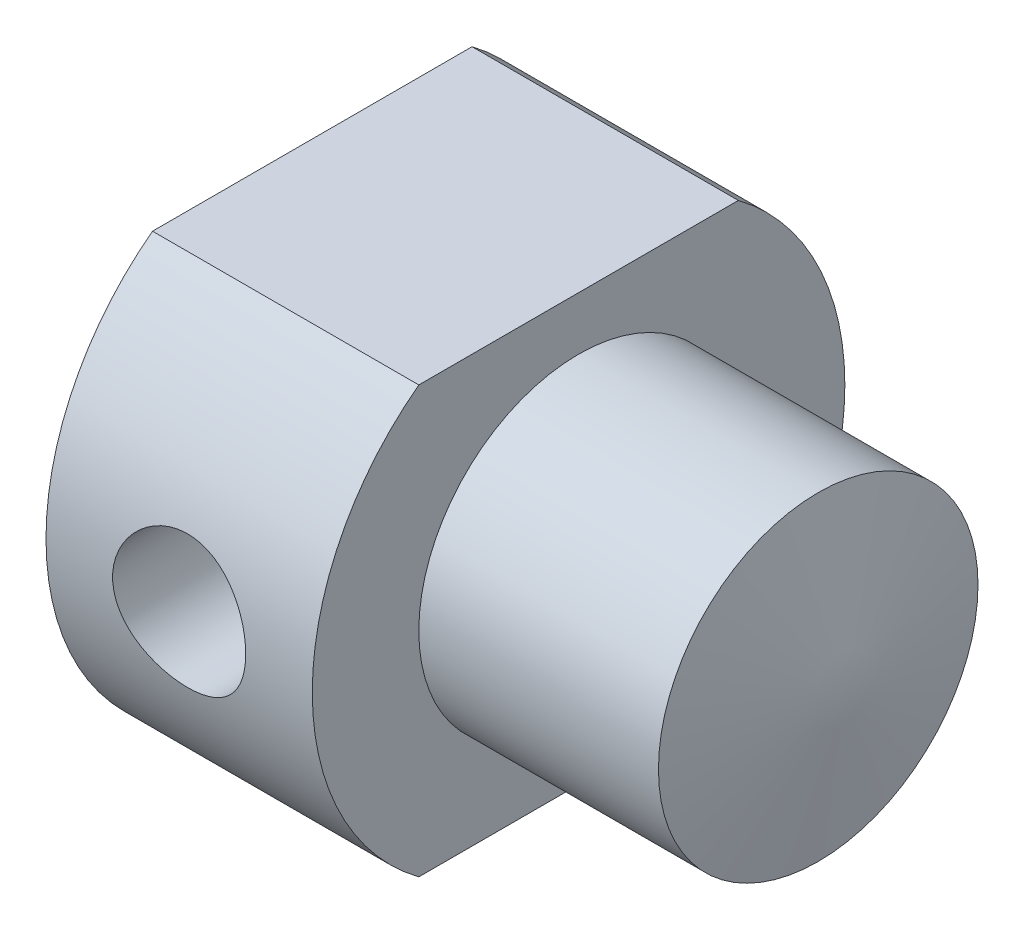
ISO-10303-21;
HEADER;
FILE_DESCRIPTION(('STEP AP214'),'2;1');
FILE_NAME('part.step','',(''),(''),'','','');
FILE_SCHEMA(('AUTOMOTIVE_DESIGN { 1 0 10303 214 1 1 1 1 }'));
ENDSEC;
DATA;
#1=APPLICATION_CONTEXT('core data for automotive mechanical design processes');
#2=APPLICATION_PROTOCOL_DEFINITION('international standard','automotive_design',2000,#1);
#3=PRODUCT_CONTEXT('',#1,'mechanical');
#4=PRODUCT('Part','Part','',(#3));
#5=PRODUCT_RELATED_PRODUCT_CATEGORY('part','',(#4));
#6=PRODUCT_DEFINITION_FORMATION('','',#4);
#7=PRODUCT_DEFINITION_CONTEXT('part definition',#1,'design');
#8=PRODUCT_DEFINITION('design','',#6,#7);
#9=PRODUCT_DEFINITION_SHAPE('','',#8);
#10=(LENGTH_UNIT() NAMED_UNIT(*) SI_UNIT(.MILLI.,.METRE.));
#11=(NAMED_UNIT(*) PLANE_ANGLE_UNIT() SI_UNIT($,.RADIAN.));
#12=(NAMED_UNIT(*) SI_UNIT($,.STERADIAN.) SOLID_ANGLE_UNIT());
#13=UNCERTAINTY_MEASURE_WITH_UNIT(LENGTH_MEASURE(1.E-05),#10,'distance_accuracy_value','');
#14=(GEOMETRIC_REPRESENTATION_CONTEXT(3) GLOBAL_UNCERTAINTY_ASSIGNED_CONTEXT((#13)) GLOBAL_UNIT_ASSIGNED_CONTEXT((#10,
#11,#12)) REPRESENTATION_CONTEXT('',''));
#15=CARTESIAN_POINT('',(0.,0.,0.));
#16=DIRECTION('',(0.,0.,1.));
#17=DIRECTION('',(1.,0.,0.));
#18=AXIS2_PLACEMENT_3D('',#15,#16,#17);
#19=CARTESIAN_POINT('',(0.,0.,0.));
#20=DIRECTION('',(1.,0.,0.));
#21=DIRECTION('',(0.,0.,-1.));
#22=AXIS2_PLACEMENT_3D('',#19,#20,#21);
#23=CYLINDRICAL_SURFACE('',#22,10.);
#24=DIRECTION('',(1.,0.,0.));
#25=VECTOR('',#24,1.);
#26=CARTESIAN_POINT('',(0.,8.,-6.00000000000001));
#27=LINE('',#26,#25);
#28=CARTESIAN_POINT('',(-10.0579618842508,8.,-6.00000000000001));
#29=VERTEX_POINT('',#28);
#30=CARTESIAN_POINT('',(-20.0579618842508,8.,-6.00000000000001));
#31=VERTEX_POINT('',#30);
#32=EDGE_CURVE('E59',#29,#31,#27,.F.);
#33=ORIENTED_EDGE('',*,*,#32,.F.);
#34=CARTESIAN_POINT('',(-10.0579618842508,0.,0.));
#35=DIRECTION('',(1.,0.,0.));
#36=DIRECTION('',(0.,0.,-1.));
#37=AXIS2_PLACEMENT_3D('',#34,#35,#36);
#38=CIRCLE('',#37,10.);
#39=CARTESIAN_POINT('',(-10.0579618842508,-8.,-6.));
#40=VERTEX_POINT('',#39);
#41=EDGE_CURVE('E92',#40,#29,#38,.T.);
#42=ORIENTED_EDGE('',*,*,#41,.F.);
#43=DIRECTION('',(1.,0.,0.));
#44=VECTOR('',#43,1.);
#45=CARTESIAN_POINT('',(0.,-8.,-6.));
#46=LINE('',#45,#44);
#47=CARTESIAN_POINT('',(-20.0579618842508,-8.,-6.));
#48=VERTEX_POINT('',#47);
#49=EDGE_CURVE('E79',#48,#40,#46,.T.);
#50=ORIENTED_EDGE('',*,*,#49,.F.);
#51=CARTESIAN_POINT('',(-20.0579618842508,0.,0.));
#52=DIRECTION('',(1.,0.,0.));
#53=DIRECTION('',(0.,0.,-1.));
#54=AXIS2_PLACEMENT_3D('',#51,#52,#53);
#55=CIRCLE('',#54,10.);
#56=EDGE_CURVE('E90',#48,#31,#55,.T.);
#57=ORIENTED_EDGE('',*,*,#56,.T.);
#58=EDGE_LOOP('',(#33,#42,#50,#57));
#59=FACE_BOUND('',#58,.T.);
#60=CARTESIAN_POINT('',(-17.5579618842508,0.,-10.));
#61=CARTESIAN_POINT('',(-17.5579580080206,0.138126814449552,-9.99999766446687));
#62=CARTESIAN_POINT('',(-17.5464759662945,0.276296929717938,-9.99710963553044));
#63=CARTESIAN_POINT('',(-17.5009199654058,0.548677206284221,-9.98586856383157));
#64=CARTESIAN_POINT('',(-17.4668332016877,0.682885078117899,-9.97751242366627));
#65=CARTESIAN_POINT('',(-17.3772297951473,0.943368120304294,-9.9562604388672));
#66=CARTESIAN_POINT('',(-17.321738886392,1.06965260571667,-9.94337004736764));
#67=CARTESIAN_POINT('',(-17.1909929008427,1.31112021984071,-9.91442239679369));
#68=CARTESIAN_POINT('',(-17.1157371573859,1.4263029739146,-9.89836503090261));
#69=CARTESIAN_POINT('',(-16.9459605681605,1.64466987883486,-9.86445689319489));
#70=CARTESIAN_POINT('',(-16.851109259319,1.74759281676843,-9.84657845246877));
#71=CARTESIAN_POINT('',(-16.6455415427358,1.93624821200553,-9.8112270019656));
#72=CARTESIAN_POINT('',(-16.5348233460059,2.02197872824865,-9.79375403816446));
#73=CARTESIAN_POINT('',(-16.2986365063558,2.17504423799829,-9.76091292830281));
#74=CARTESIAN_POINT('',(-16.1729731662363,2.2420870265419,-9.74557990774685));
#75=CARTESIAN_POINT('',(-15.9117145314841,2.35399484758457,-9.71915824696694));
#76=CARTESIAN_POINT('',(-15.7761208286975,2.39886342573357,-9.70806892824031));
#77=CARTESIAN_POINT('',(-15.5017227205814,2.46425806134127,-9.69167461160538));
#78=CARTESIAN_POINT('',(-15.3630370575208,2.48525378055342,-9.68625818328352));
#79=CARTESIAN_POINT('',(-15.0840142692519,2.50376962511068,-9.68148937432652));
#80=CARTESIAN_POINT('',(-14.9436774164306,2.50129356969685,-9.68213600713214));
#81=CARTESIAN_POINT('',(-14.6689355380086,2.47331087439951,-9.68932009194695));
#82=CARTESIAN_POINT('',(-14.5344691818086,2.44836390031772,-9.69571438345489));
#83=CARTESIAN_POINT('',(-14.2716934660657,2.37704031150499,-9.71344516118448));
#84=CARTESIAN_POINT('',(-14.1433845458693,2.33066217011565,-9.72478199948731));
#85=CARTESIAN_POINT('',(-13.8950651904973,2.21731579656197,-9.75125189842765));
#86=CARTESIAN_POINT('',(-13.7751515979349,2.1501444453882,-9.76642212449693));
#87=CARTESIAN_POINT('',(-13.5480973679894,1.99726046002491,-9.79882851409985));
#88=CARTESIAN_POINT('',(-13.4409589708054,1.91154458134806,-9.81606503891047));
#89=CARTESIAN_POINT('',(-13.2392891914268,1.72110570780203,-9.85126467566486));
#90=CARTESIAN_POINT('',(-13.1452044008152,1.61591043027643,-9.86923449130002));
#91=CARTESIAN_POINT('',(-12.9759264801443,1.39101986250616,-9.90343275964594));
#92=CARTESIAN_POINT('',(-12.9007339271449,1.27132412951323,-9.91966115915679));
#93=CARTESIAN_POINT('',(-12.7712109072102,1.02019314780231,-9.94862886823651));
#94=CARTESIAN_POINT('',(-12.7169529838268,0.888718988681034,-9.96135600212879));
#95=CARTESIAN_POINT('',(-12.6314330414015,0.618126680238133,-9.98179861652361));
#96=CARTESIAN_POINT('',(-12.6001666235539,0.479009998584137,-9.98951505565468));
#97=CARTESIAN_POINT('',(-12.5621992749861,0.200899950650041,-9.99892498785624));
#98=CARTESIAN_POINT('',(-12.5548901741253,0.0619945333136793,-10.0007675584713));
#99=CARTESIAN_POINT('',(-12.5633768876766,-0.215054791335851,-9.99864674690754));
#100=CARTESIAN_POINT('',(-12.5791706222494,-0.353198766074331,-9.99468388736421));
#101=CARTESIAN_POINT('',(-12.6329133982364,-0.622690447960821,-9.98149301878918));
#102=CARTESIAN_POINT('',(-12.6705306567124,-0.754108531614587,-9.97234390309647));
#103=CARTESIAN_POINT('',(-12.7664736909649,-1.00876215408753,-9.94981177723595));
#104=CARTESIAN_POINT('',(-12.8248015581062,-1.13199686505442,-9.93642833949965));
#105=CARTESIAN_POINT('',(-12.9616887657086,-1.36920522404972,-9.9065551321037));
#106=CARTESIAN_POINT('',(-13.0405887382451,-1.48297573639295,-9.89001445610999));
#107=CARTESIAN_POINT('',(-13.2159450655794,-1.69587768940552,-9.85574181979587));
#108=CARTESIAN_POINT('',(-13.3124044502802,-1.79500659828875,-9.83800965421578));
#109=CARTESIAN_POINT('',(-13.5229651523237,-1.97831761345414,-9.80281594932498));
#110=CARTESIAN_POINT('',(-13.6374413892501,-2.06207311270184,-9.78537173637463));
#111=CARTESIAN_POINT('',(-13.8791829416984,-2.20918459835605,-9.75321463970069));
#112=CARTESIAN_POINT('',(-14.0064476892016,-2.27254149026901,-9.73850163474941));
#113=CARTESIAN_POINT('',(-14.2694714215945,-2.37658570101224,-9.71363491194665));
#114=CARTESIAN_POINT('',(-14.4051745981046,-2.41740732773931,-9.70345425375809));
#115=CARTESIAN_POINT('',(-14.6818112806763,-2.47557609990489,-9.68877906706585));
#116=CARTESIAN_POINT('',(-14.8227436359532,-2.49292837912652,-9.68428329504044));
#117=CARTESIAN_POINT('',(-15.1014969240202,-2.50339765056083,-9.68158168701612));
#118=CARTESIAN_POINT('',(-15.2392909427949,-2.49719649630132,-9.68319887888035));
#119=CARTESIAN_POINT('',(-15.5118016986946,-2.46229546385366,-9.69213181672143));
#120=CARTESIAN_POINT('',(-15.6465184976061,-2.43359603781098,-9.69944744817731));
#121=CARTESIAN_POINT('',(-15.9083093160273,-2.35488553240496,-9.71885434473222));
#122=CARTESIAN_POINT('',(-16.0354240596514,-2.30500234113404,-9.73091692061057));
#123=CARTESIAN_POINT('',(-16.2795708554401,-2.18544152267504,-9.7584625954084));
#124=CARTESIAN_POINT('',(-16.396601506229,-2.11576115005696,-9.77394616867808));
#125=CARTESIAN_POINT('',(-16.6205529325876,-1.95644624772858,-9.80709390439337));
#126=CARTESIAN_POINT('',(-16.7271303399574,-1.86633860485377,-9.82480441386302));
#127=CARTESIAN_POINT('',(-16.9238736255765,-1.66964895198289,-9.86013378743769));
#128=CARTESIAN_POINT('',(-17.0140356011058,-1.56306303543524,-9.87775262878422));
#129=CARTESIAN_POINT('',(-17.1769807318585,-1.33411264450432,-9.91129426079449));
#130=CARTESIAN_POINT('',(-17.2494195737035,-1.21149737052731,-9.92718055609783));
#131=CARTESIAN_POINT('',(-17.3725409891517,-0.955443432517461,-9.95508208291861));
#132=CARTESIAN_POINT('',(-17.4232391519984,-0.822012605727901,-9.96710008666301));
#133=CARTESIAN_POINT('',(-17.4939149348002,-0.574017088739121,-9.98413432609236));
#134=CARTESIAN_POINT('',(-17.5178806226732,-0.460633618180115,-9.99004308421151));
#135=CARTESIAN_POINT('',(-17.5499051236207,-0.231510119227139,-9.9979767538658));
#136=CARTESIAN_POINT('',(-17.557965133093,-0.115770268737694,-10.0000019575149));
#137=CARTESIAN_POINT('',(-17.5579618842508,0.,-10.));
#138=B_SPLINE_CURVE_WITH_KNOTS('',3,(#60,#61,#62,#63,#64,#65,#66,#67,#68,#69,#70,#71,#72,#73,
#74,#75,#76,#77,#78,#79,#80,#81,#82,#83,#84,#85,#86,#87,#88,#89,#90,#91,#92,#93,#94,#95,#96,#97,
#98,#99,#100,#101,#102,#103,#104,#105,#106,#107,#108,#109,#110,#111,#112,#113,#114,#115,#116,
#117,#118,#119,#120,#121,#122,#123,#124,#125,#126,#127,#128,#129,#130,#131,#132,#133,#134,#135,
#136,#137),.UNSPECIFIED.,.T.,.F.,(4,2,2,2,2,2,2,2,2,2,2,2,2,2,2,2,2,2,2,2,2,2,2,2,2,2,2,2,2,2,2,
2,2,2,2,2,2,2,4),(0.,0.41395618745315,0.828147062939832,1.24184150381018,1.65554990028221,
2.07690725728565,2.4983121596677,2.92597745909678,3.35357435282281,3.77260491835116,
4.19156730193363,4.60037495017231,5.00921172448932,5.42217546462,5.83521151399139,
6.26002501620567,6.6848514926928,7.11113715020725,7.53734122819939,7.95263848254328,
8.36789835193439,8.7770045752893,9.18615212209352,9.60255979281121,10.0190393835223,
10.4457418201299,10.8724253125471,11.2965375769764,11.7205570543048,12.1323963400748,
12.5442273493652,12.9536066760888,13.3630428023797,13.7831596069298,14.2033761629383,
14.6312030917578,15.0587227304538,15.4057040491338,15.752659267482),.UNSPECIFIED.);
#139=CARTESIAN_POINT('',(-17.5579618842508,0.,-10.));
#140=VERTEX_POINT('',#139);
#141=EDGE_CURVE('E96',#140,#140,#138,.T.);
#142=ORIENTED_EDGE('',*,*,#141,.F.);
#143=EDGE_LOOP('',(#142));
#144=FACE_BOUND('',#143,.T.);
#145=ADVANCED_FACE('F37',(#59,#144),#23,.T.);
#146=CARTESIAN_POINT('',(0.,0.,0.));
#147=DIRECTION('',(-1.,0.,0.));
#148=DIRECTION('',(0.,0.,1.));
#149=AXIS2_PLACEMENT_3D('',#146,#147,#148);
#150=CONICAL_SURFACE('',#149,0.,1.39626340159546);
#151=CARTESIAN_POINT('',(-1.05796188425082,0.,0.));
#152=DIRECTION('',(1.,0.,0.));
#153=DIRECTION('',(0.,0.,-1.));
#154=AXIS2_PLACEMENT_3D('',#151,#152,#153);
#155=CIRCLE('',#154,6.);
#156=CARTESIAN_POINT('',(-1.05796188425082,0.,-6.));
#157=VERTEX_POINT('',#156);
#158=EDGE_CURVE('E85',#157,#157,#155,.T.);
#159=ORIENTED_EDGE('',*,*,#158,.T.);
#160=EDGE_LOOP('',(#159));
#161=FACE_BOUND('',#160,.T.);
#162=CARTESIAN_POINT('',(0.,0.,0.));
#163=VERTEX_POINT('',#162);
#164=VERTEX_LOOP('',#163);
#165=FACE_BOUND('',#164,.T.);
#166=ADVANCED_FACE('F39',(#161,#165),#150,.T.);
#167=CARTESIAN_POINT('',(0.,0.,0.));
#168=DIRECTION('',(1.,0.,0.));
#169=DIRECTION('',(0.,0.,-1.));
#170=AXIS2_PLACEMENT_3D('',#167,#168,#169);
#171=CYLINDRICAL_SURFACE('',#170,6.);
#172=CARTESIAN_POINT('',(-10.0579618842508,0.,0.));
#173=DIRECTION('',(1.,0.,0.));
#174=DIRECTION('',(0.,0.,-1.));
#175=AXIS2_PLACEMENT_3D('',#172,#173,#174);
#176=CIRCLE('',#175,6.);
#177=CARTESIAN_POINT('',(-10.0579618842508,0.,-6.));
#178=VERTEX_POINT('',#177);
#179=EDGE_CURVE('E107',#178,#178,#176,.T.);
#180=ORIENTED_EDGE('',*,*,#179,.T.);
#181=EDGE_LOOP('',(#180));
#182=FACE_BOUND('',#181,.T.);
#183=ORIENTED_EDGE('',*,*,#158,.F.);
#184=EDGE_LOOP('',(#183));
#185=FACE_BOUND('',#184,.T.);
#186=ADVANCED_FACE('F140',(#182,#185),#171,.T.);
#187=CARTESIAN_POINT('',(-10.0579618842508,6.,0.));
#188=DIRECTION('',(1.,0.,0.));
#189=DIRECTION('',(0.,0.,-1.));
#190=AXIS2_PLACEMENT_3D('',#187,#188,#189);
#191=PLANE('',#190);
#192=DIRECTION('',(0.,0.,-1.));
#193=VECTOR('',#192,1.);
#194=CARTESIAN_POINT('',(-10.0579618842508,8.,0.));
#195=LINE('',#194,#193);
#196=CARTESIAN_POINT('',(-10.0579618842508,8.,6.00000000000001));
#197=VERTEX_POINT('',#196);
#198=EDGE_CURVE('E103',#197,#29,#195,.T.);
#199=ORIENTED_EDGE('',*,*,#198,.F.);
#200=CARTESIAN_POINT('',(-10.0579618842508,-8.,6.));
#201=VERTEX_POINT('',#200);
#202=EDGE_CURVE('E106',#197,#201,#38,.T.);
#203=ORIENTED_EDGE('',*,*,#202,.T.);
#204=DIRECTION('',(0.,0.,1.));
#205=VECTOR('',#204,1.);
#206=CARTESIAN_POINT('',(-10.0579618842508,-8.,0.));
#207=LINE('',#206,#205);
#208=EDGE_CURVE('E163',#40,#201,#207,.T.);
#209=ORIENTED_EDGE('',*,*,#208,.F.);
#210=ORIENTED_EDGE('',*,*,#41,.T.);
#211=EDGE_LOOP('',(#199,#203,#209,#210));
#212=FACE_BOUND('',#211,.T.);
#213=ORIENTED_EDGE('',*,*,#179,.F.);
#214=EDGE_LOOP('',(#213));
#215=FACE_BOUND('',#214,.T.);
#216=ADVANCED_FACE('F134',(#212,#215),#191,.T.);
#217=DIRECTION('',(1.,0.,0.));
#218=VECTOR('',#217,1.);
#219=CARTESIAN_POINT('',(0.,8.,6.00000000000001));
#220=LINE('',#219,#218);
#221=CARTESIAN_POINT('',(-20.0579618842508,8.,6.00000000000001));
#222=VERTEX_POINT('',#221);
#223=EDGE_CURVE('E162',#222,#197,#220,.T.);
#224=ORIENTED_EDGE('',*,*,#223,.F.);
#225=CARTESIAN_POINT('',(-20.0579618842508,-8.,6.));
#226=VERTEX_POINT('',#225);
#227=EDGE_CURVE('E95',#222,#226,#55,.T.);
#228=ORIENTED_EDGE('',*,*,#227,.T.);
#229=DIRECTION('',(1.,0.,0.));
#230=VECTOR('',#229,1.);
#231=CARTESIAN_POINT('',(0.,-8.,6.));
#232=LINE('',#231,#230);
#233=EDGE_CURVE('E52',#201,#226,#232,.F.);
#234=ORIENTED_EDGE('',*,*,#233,.F.);
#235=ORIENTED_EDGE('',*,*,#202,.F.);
#236=EDGE_LOOP('',(#224,#228,#234,#235));
#237=FACE_BOUND('',#236,.T.);
#238=CARTESIAN_POINT('',(-12.5579618842508,0.,10.));
#239=CARTESIAN_POINT('',(-12.5579657604811,0.13812681444955,9.99999766446687));
#240=CARTESIAN_POINT('',(-12.5694478022071,0.276296929717937,9.99710963553044));
#241=CARTESIAN_POINT('',(-12.6150038030958,0.548677206284219,9.98586856383157));
#242=CARTESIAN_POINT('',(-12.6490905668139,0.682885078117897,9.97751242366627));
#243=CARTESIAN_POINT('',(-12.7386939733543,0.943368120304293,9.9562604388672));
#244=CARTESIAN_POINT('',(-12.7941848821096,1.06965260571667,9.94337004736764));
#245=CARTESIAN_POINT('',(-12.9249308676589,1.31112021984071,9.91442239679369));
#246=CARTESIAN_POINT('',(-13.0001866111158,1.4263029739146,9.89836503090261));
#247=CARTESIAN_POINT('',(-13.1699632003411,1.64466987883486,9.86445689319489));
#248=CARTESIAN_POINT('',(-13.2648145091826,1.74759281676843,9.84657845246877));
#249=CARTESIAN_POINT('',(-13.4703822257659,1.93624821200553,9.8112270019656));
#250=CARTESIAN_POINT('',(-13.5811004224957,2.02197872824865,9.79375403816446));
#251=CARTESIAN_POINT('',(-13.8172872621458,2.17504423799829,9.76091292830281));
#252=CARTESIAN_POINT('',(-13.9429506022654,2.2420870265419,9.74557990774685));
#253=CARTESIAN_POINT('',(-14.2042092370175,2.35399484758457,9.71915824696694));
#254=CARTESIAN_POINT('',(-14.3398029398042,2.39886342573357,9.70806892824031));
#255=CARTESIAN_POINT('',(-14.6142010479203,2.46425806134127,9.69167461160538));
#256=CARTESIAN_POINT('',(-14.7528867109808,2.48525378055342,9.68625818328352));
#257=CARTESIAN_POINT('',(-15.0319094992497,2.50376962511068,9.68148937432652));
#258=CARTESIAN_POINT('',(-15.172246352071,2.50129356969685,9.68213600713214));
#259=CARTESIAN_POINT('',(-15.4469882304931,2.47331087439951,9.68932009194695));
#260=CARTESIAN_POINT('',(-15.581454586693,2.44836390031772,9.69571438345489));
#261=CARTESIAN_POINT('',(-15.8442303024359,2.37704031150499,9.71344516118448));
#262=CARTESIAN_POINT('',(-15.9725392226324,2.33066217011565,9.72478199948731));
#263=CARTESIAN_POINT('',(-16.2208585780044,2.21731579656197,9.75125189842765));
#264=CARTESIAN_POINT('',(-16.3407721705668,2.1501444453882,9.76642212449694));
#265=CARTESIAN_POINT('',(-16.5678264005122,1.99726046002491,9.79882851409985));
#266=CARTESIAN_POINT('',(-16.6749647976962,1.91154458134806,9.81606503891047));
#267=CARTESIAN_POINT('',(-16.8766345770748,1.72110570780203,9.85126467566485));
#268=CARTESIAN_POINT('',(-16.9707193676864,1.61591043027643,9.86923449130002));
#269=CARTESIAN_POINT('',(-17.1399972883573,1.39101986250616,9.90343275964594));
#270=CARTESIAN_POINT('',(-17.2151898413568,1.27132412951324,9.91966115915679));
#271=CARTESIAN_POINT('',(-17.3447128612915,1.02019314780232,9.94862886823651));
#272=CARTESIAN_POINT('',(-17.3989707846749,0.888718988681037,9.96135600212878));
#273=CARTESIAN_POINT('',(-17.4844907271001,0.618126680238137,9.98179861652361));
#274=CARTESIAN_POINT('',(-17.5157571449477,0.47900999858414,9.98951505565468));
#275=CARTESIAN_POINT('',(-17.5537244935155,0.200899950650043,9.99892498785624));
#276=CARTESIAN_POINT('',(-17.5610335943763,0.061994533313681,10.0007675584713));
#277=CARTESIAN_POINT('',(-17.552546880825,-0.21505479133585,9.99864674690754));
#278=CARTESIAN_POINT('',(-17.5367531462523,-0.353198766074329,9.99468388736421));
#279=CARTESIAN_POINT('',(-17.4830103702652,-0.62269044796082,9.98149301878918));
#280=CARTESIAN_POINT('',(-17.4453931117892,-0.754108531614586,9.97234390309647));
#281=CARTESIAN_POINT('',(-17.3494500775367,-1.00876215408753,9.94981177723595));
#282=CARTESIAN_POINT('',(-17.2911222103954,-1.13199686505442,9.93642833949965));
#283=CARTESIAN_POINT('',(-17.154235002793,-1.36920522404972,9.9065551321037));
#284=CARTESIAN_POINT('',(-17.0753350302565,-1.48297573639294,9.89001445610999));
#285=CARTESIAN_POINT('',(-16.8999787029222,-1.69587768940552,9.85574181979587));
#286=CARTESIAN_POINT('',(-16.8035193182214,-1.79500659828875,9.83800965421578));
#287=CARTESIAN_POINT('',(-16.592958616178,-1.97831761345414,9.80281594932498));
#288=CARTESIAN_POINT('',(-16.4784823792515,-2.06207311270184,9.78537173637463));
#289=CARTESIAN_POINT('',(-16.2367408268032,-2.20918459835605,9.75321463970069));
#290=CARTESIAN_POINT('',(-16.1094760793001,-2.27254149026901,9.73850163474941));
#291=CARTESIAN_POINT('',(-15.8464523469071,-2.37658570101224,9.71363491194665));
#292=CARTESIAN_POINT('',(-15.710749170397,-2.41740732773931,9.70345425375809));
#293=CARTESIAN_POINT('',(-15.4341124878253,-2.47557609990489,9.68877906706585));
#294=CARTESIAN_POINT('',(-15.2931801325484,-2.49292837912652,9.68428329504044));
#295=CARTESIAN_POINT('',(-15.0144268444815,-2.50339765056083,9.68158168701612));
#296=CARTESIAN_POINT('',(-14.8766328257067,-2.49719649630132,9.68319887888034));
#297=CARTESIAN_POINT('',(-14.604122069807,-2.46229546385366,9.69213181672143));
#298=CARTESIAN_POINT('',(-14.4694052708955,-2.43359603781098,9.69944744817732));
#299=CARTESIAN_POINT('',(-14.2076144524744,-2.35488553240496,9.71885434473222));
#300=CARTESIAN_POINT('',(-14.0804997088503,-2.30500234113404,9.73091692061057));
#301=CARTESIAN_POINT('',(-13.8363529130615,-2.18544152267504,9.7584625954084));
#302=CARTESIAN_POINT('',(-13.7193222622727,-2.11576115005696,9.77394616867808));
#303=CARTESIAN_POINT('',(-13.4953708359141,-1.95644624772858,9.80709390439337));
#304=CARTESIAN_POINT('',(-13.3887934285442,-1.86633860485376,9.82480441386302));
#305=CARTESIAN_POINT('',(-13.1920501429252,-1.66964895198289,9.86013378743769));
#306=CARTESIAN_POINT('',(-13.1018881673959,-1.56306303543524,9.87775262878422));
#307=CARTESIAN_POINT('',(-12.9389430366431,-1.33411264450432,9.9112942607945));
#308=CARTESIAN_POINT('',(-12.8665041947982,-1.21149737052731,9.92718055609783));
#309=CARTESIAN_POINT('',(-12.7433827793499,-0.95544343251746,9.95508208291861));
#310=CARTESIAN_POINT('',(-12.6926846165033,-0.822012605727899,9.96710008666301));
#311=CARTESIAN_POINT('',(-12.6220088337014,-0.57401708873912,9.98413432609236));
#312=CARTESIAN_POINT('',(-12.5980431458284,-0.460633618180116,9.99004308421151));
#313=CARTESIAN_POINT('',(-12.5660186448809,-0.231510119227141,9.9979767538658));
#314=CARTESIAN_POINT('',(-12.5579586354086,-0.115770268737696,10.0000019575149));
#315=CARTESIAN_POINT('',(-12.5579618842508,0.,10.));
#316=B_SPLINE_CURVE_WITH_KNOTS('',3,(#238,#239,#240,#241,#242,#243,#244,#245,#246,#247,#248,
#249,#250,#251,#252,#253,#254,#255,#256,#257,#258,#259,#260,#261,#262,#263,#264,#265,#266,#267,
#268,#269,#270,#271,#272,#273,#274,#275,#276,#277,#278,#279,#280,#281,#282,#283,#284,#285,#286,
#287,#288,#289,#290,#291,#292,#293,#294,#295,#296,#297,#298,#299,#300,#301,#302,#303,#304,#305,
#306,#307,#308,#309,#310,#311,#312,#313,#314,#315),.UNSPECIFIED.,.T.,.F.,(4,2,2,2,2,2,2,2,2,2,2,
2,2,2,2,2,2,2,2,2,2,2,2,2,2,2,2,2,2,2,2,2,2,2,2,2,2,2,4),(0.,0.413956187453149,
0.828147062939833,1.24184150381018,1.65554990028221,2.07690725728565,2.4983121596677,
2.92597745909678,3.35357435282281,3.77260491835116,4.19156730193363,4.60037495017231,
5.00921172448932,5.42217546462,5.83521151399139,6.26002501620567,6.6848514926928,
7.11113715020724,7.53734122819939,7.95263848254328,8.36789835193439,8.7770045752893,
9.18615212209352,9.60255979281121,10.0190393835223,10.4457418201299,10.8724253125471,
11.2965375769764,11.7205570543048,12.1323963400748,12.5442273493652,12.9536066760888,
13.3630428023797,13.7831596069298,14.2033761629383,14.6312030917578,15.0587227304538,
15.4057040491338,15.752659267482),.UNSPECIFIED.);
#317=CARTESIAN_POINT('',(-12.5579618842508,0.,10.));
#318=VERTEX_POINT('',#317);
#319=EDGE_CURVE('E99',#318,#318,#316,.T.);
#320=ORIENTED_EDGE('',*,*,#319,.F.);
#321=EDGE_LOOP('',(#320));
#322=FACE_BOUND('',#321,.T.);
#323=ADVANCED_FACE('F119',(#237,#322),#23,.T.);
#324=CARTESIAN_POINT('',(-20.0579618842508,10.,0.));
#325=DIRECTION('',(-1.,0.,0.));
#326=DIRECTION('',(0.,0.,1.));
#327=AXIS2_PLACEMENT_3D('',#324,#325,#326);
#328=PLANE('',#327);
#329=DIRECTION('',(0.,0.,1.));
#330=VECTOR('',#329,1.);
#331=CARTESIAN_POINT('',(-20.0579618842508,8.,0.));
#332=LINE('',#331,#330);
#333=EDGE_CURVE('E11',#31,#222,#332,.T.);
#334=ORIENTED_EDGE('',*,*,#333,.F.);
#335=ORIENTED_EDGE('',*,*,#56,.F.);
#336=DIRECTION('',(0.,0.,-1.));
#337=VECTOR('',#336,1.);
#338=CARTESIAN_POINT('',(-20.0579618842508,-8.,0.));
#339=LINE('',#338,#337);
#340=EDGE_CURVE('E45',#226,#48,#339,.T.);
#341=ORIENTED_EDGE('',*,*,#340,.F.);
#342=ORIENTED_EDGE('',*,*,#227,.F.);
#343=EDGE_LOOP('',(#334,#335,#341,#342));
#344=FACE_BOUND('',#343,.T.);
#345=ADVANCED_FACE('F94',(#344),#328,.T.);
#346=CARTESIAN_POINT('',(-15.0579618842508,0.,-15.));
#347=DIRECTION('',(0.,0.,1.));
#348=DIRECTION('',(1.,0.,0.));
#349=AXIS2_PLACEMENT_3D('',#346,#347,#348);
#350=CYLINDRICAL_SURFACE('',#349,2.5);
#351=ORIENTED_EDGE('',*,*,#141,.T.);
#352=EDGE_LOOP('',(#351));
#353=FACE_BOUND('',#352,.T.);
#354=ORIENTED_EDGE('',*,*,#319,.T.);
#355=EDGE_LOOP('',(#354));
#356=FACE_BOUND('',#355,.T.);
#357=ADVANCED_FACE('F123',(#353,#356),#350,.F.);
#358=CARTESIAN_POINT('',(-21.803077660984,-8.,-15.));
#359=DIRECTION('',(0.,1.,0.));
#360=DIRECTION('',(-1.,0.,0.));
#361=AXIS2_PLACEMENT_3D('',#358,#359,#360);
#362=PLANE('',#361);
#363=ORIENTED_EDGE('',*,*,#208,.T.);
#364=ORIENTED_EDGE('',*,*,#233,.T.);
#365=ORIENTED_EDGE('',*,*,#340,.T.);
#366=ORIENTED_EDGE('',*,*,#49,.T.);
#367=EDGE_LOOP('',(#363,#364,#365,#366));
#368=FACE_BOUND('',#367,.T.);
#369=ADVANCED_FACE('F78',(#368),#362,.F.);
#370=CARTESIAN_POINT('',(-21.803077660984,8.,-15.));
#371=DIRECTION('',(0.,-1.,0.));
#372=DIRECTION('',(0.,0.,-1.));
#373=AXIS2_PLACEMENT_3D('',#370,#371,#372);
#374=PLANE('',#373);
#375=ORIENTED_EDGE('',*,*,#198,.T.);
#376=ORIENTED_EDGE('',*,*,#32,.T.);
#377=ORIENTED_EDGE('',*,*,#333,.T.);
#378=ORIENTED_EDGE('',*,*,#223,.T.);
#379=EDGE_LOOP('',(#375,#376,#377,#378));
#380=FACE_BOUND('',#379,.T.);
#381=ADVANCED_FACE('F167',(#380),#374,.F.);
#382=CLOSED_SHELL('',(#145,#166,#186,#216,#323,#345,#357,#369,#381));
#383=MANIFOLD_SOLID_BREP('B2',#382);
#384=ADVANCED_BREP_SHAPE_REPRESENTATION('',(#18,#383),#14);
#385=SHAPE_DEFINITION_REPRESENTATION(#9,#384);
ENDSEC;
END-ISO-10303-21;
